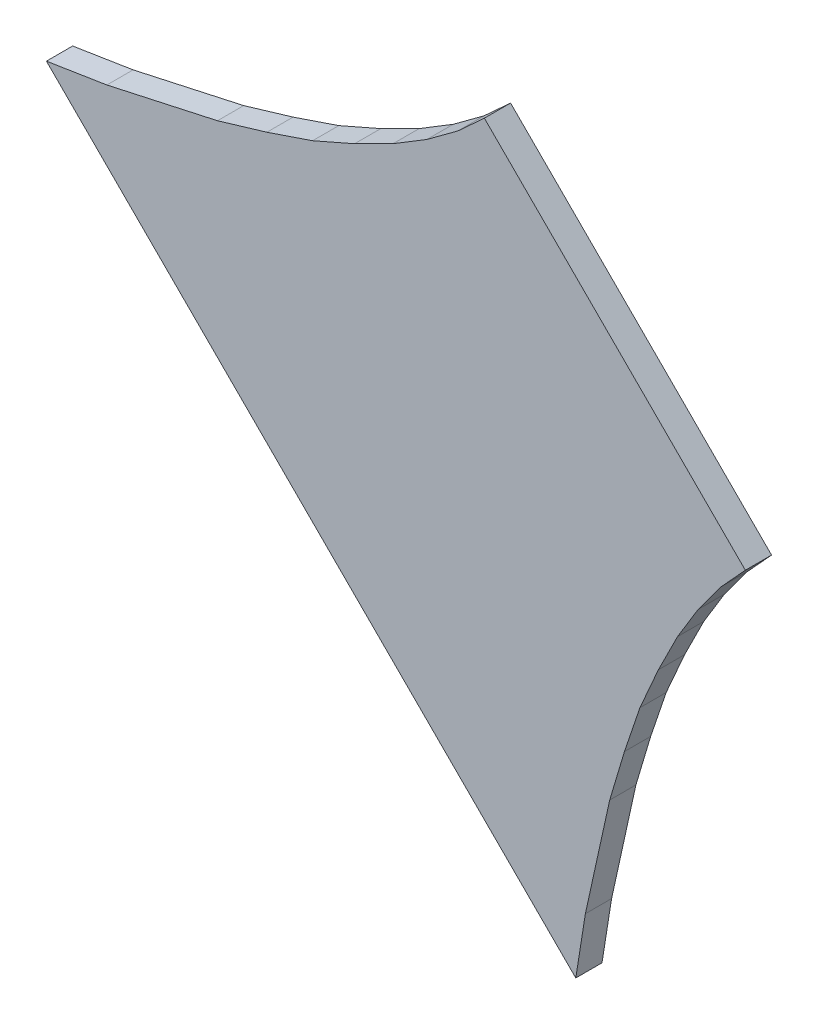
ISO-10303-21;
HEADER;
FILE_DESCRIPTION(('STEP AP214'),'2;1');
FILE_NAME('part.step','',(''),(''),'','','');
FILE_SCHEMA(('AUTOMOTIVE_DESIGN { 1 0 10303 214 1 1 1 1 }'));
ENDSEC;
DATA;
#1=APPLICATION_CONTEXT('core data for automotive mechanical design processes');
#2=APPLICATION_PROTOCOL_DEFINITION('international standard','automotive_design',2000,#1);
#3=PRODUCT_CONTEXT('',#1,'mechanical');
#4=PRODUCT('Part','Part','',(#3));
#5=PRODUCT_RELATED_PRODUCT_CATEGORY('part','',(#4));
#6=PRODUCT_DEFINITION_FORMATION('','',#4);
#7=PRODUCT_DEFINITION_CONTEXT('part definition',#1,'design');
#8=PRODUCT_DEFINITION('design','',#6,#7);
#9=PRODUCT_DEFINITION_SHAPE('','',#8);
#10=(LENGTH_UNIT() NAMED_UNIT(*) SI_UNIT(.MILLI.,.METRE.));
#11=(NAMED_UNIT(*) PLANE_ANGLE_UNIT() SI_UNIT($,.RADIAN.));
#12=(NAMED_UNIT(*) SI_UNIT($,.STERADIAN.) SOLID_ANGLE_UNIT());
#13=UNCERTAINTY_MEASURE_WITH_UNIT(LENGTH_MEASURE(1.E-05),#10,'distance_accuracy_value','');
#14=(GEOMETRIC_REPRESENTATION_CONTEXT(3) GLOBAL_UNCERTAINTY_ASSIGNED_CONTEXT((#13)) GLOBAL_UNIT_ASSIGNED_CONTEXT((#10,
#11,#12)) REPRESENTATION_CONTEXT('',''));
#15=CARTESIAN_POINT('',(0.,0.,0.));
#16=DIRECTION('',(0.,0.,1.));
#17=DIRECTION('',(1.,0.,0.));
#18=AXIS2_PLACEMENT_3D('',#15,#16,#17);
#19=CARTESIAN_POINT('',(86.4049987792969,96.359001159668,0.));
#20=DIRECTION('',(0.675823662339763,-0.737063346953075,0.));
#21=DIRECTION('',(-0.737063346953075,-0.675823662339763,0.));
#22=AXIS2_PLACEMENT_3D('',#19,#20,#21);
#23=PLANE('',#22);
#24=DIRECTION('',(-0.737063346953075,-0.675823662339763,0.));
#25=VECTOR('',#24,1.);
#26=CARTESIAN_POINT('',(86.4049987792969,96.359001159668,0.03556));
#27=LINE('',#26,#25);
#28=CARTESIAN_POINT('',(86.4049987792969,96.359001159668,0.03556));
#29=VERTEX_POINT('',#28);
#30=CARTESIAN_POINT('',(86.3690032958984,96.3259963989258,0.03556));
#31=VERTEX_POINT('',#30);
#32=EDGE_CURVE('E11',#29,#31,#27,.T.);
#33=ORIENTED_EDGE('',*,*,#32,.F.);
#34=DIRECTION('',(0.,0.,1.));
#35=VECTOR('',#34,1.);
#36=CARTESIAN_POINT('',(86.4049987792969,96.359001159668,0.));
#37=LINE('',#36,#35);
#38=CARTESIAN_POINT('',(86.4049987792969,96.359001159668,0.));
#39=VERTEX_POINT('',#38);
#40=EDGE_CURVE('E24',#39,#29,#37,.T.);
#41=ORIENTED_EDGE('',*,*,#40,.F.);
#42=DIRECTION('',(-0.737063346953075,-0.675823662339763,0.));
#43=VECTOR('',#42,1.);
#44=CARTESIAN_POINT('',(86.4049987792969,96.359001159668,0.));
#45=LINE('',#44,#43);
#46=CARTESIAN_POINT('',(86.3690032958984,96.3259963989258,0.));
#47=VERTEX_POINT('',#46);
#48=EDGE_CURVE('E172',#39,#47,#45,.T.);
#49=ORIENTED_EDGE('',*,*,#48,.T.);
#50=DIRECTION('',(0.,0.,1.));
#51=VECTOR('',#50,1.);
#52=CARTESIAN_POINT('',(86.3690032958984,96.3259963989258,0.));
#53=LINE('',#52,#51);
#54=EDGE_CURVE('E37',#47,#31,#53,.T.);
#55=ORIENTED_EDGE('',*,*,#54,.T.);
#56=EDGE_LOOP('',(#33,#41,#49,#55));
#57=FACE_BOUND('',#56,.T.);
#58=ADVANCED_FACE('F17',(#57),#23,.F.);
#59=CARTESIAN_POINT('',(86.3690032958984,96.3259963989258,0.));
#60=DIRECTION('',(0.593832022525237,-0.80458904356422,0.));
#61=DIRECTION('',(-0.80458904356422,-0.593832022525237,0.));
#62=AXIS2_PLACEMENT_3D('',#59,#60,#61);
#63=PLANE('',#62);
#64=DIRECTION('',(-0.80458904356422,-0.593832022525237,0.));
#65=VECTOR('',#64,1.);
#66=CARTESIAN_POINT('',(86.3690032958984,96.3259963989258,0.03556));
#67=LINE('',#66,#65);
#68=CARTESIAN_POINT('',(86.3270034790039,96.2949981689453,0.03556));
#69=VERTEX_POINT('',#68);
#70=EDGE_CURVE('E308',#31,#69,#67,.T.);
#71=ORIENTED_EDGE('',*,*,#70,.F.);
#72=ORIENTED_EDGE('',*,*,#54,.F.);
#73=DIRECTION('',(-0.80458904356422,-0.593832022525237,0.));
#74=VECTOR('',#73,1.);
#75=CARTESIAN_POINT('',(86.3690032958984,96.3259963989258,0.));
#76=LINE('',#75,#74);
#77=CARTESIAN_POINT('',(86.3270034790039,96.2949981689453,0.));
#78=VERTEX_POINT('',#77);
#79=EDGE_CURVE('E305',#47,#78,#76,.T.);
#80=ORIENTED_EDGE('',*,*,#79,.T.);
#81=DIRECTION('',(0.,0.,1.));
#82=VECTOR('',#81,1.);
#83=CARTESIAN_POINT('',(86.3270034790039,96.2949981689453,0.));
#84=LINE('',#83,#82);
#85=EDGE_CURVE('E303',#78,#69,#84,.T.);
#86=ORIENTED_EDGE('',*,*,#85,.T.);
#87=EDGE_LOOP('',(#71,#72,#80,#86));
#88=FACE_BOUND('',#87,.T.);
#89=ADVANCED_FACE('F316',(#88),#63,.F.);
#90=CARTESIAN_POINT('',(86.3270034790039,96.2949981689453,0.));
#91=DIRECTION('',(0.51990200491478,-0.854225909982595,0.));
#92=DIRECTION('',(-0.854225909982595,-0.51990200491478,0.));
#93=AXIS2_PLACEMENT_3D('',#90,#91,#92);
#94=PLANE('',#93);
#95=DIRECTION('',(-0.854225909982595,-0.51990200491478,0.));
#96=VECTOR('',#95,1.);
#97=CARTESIAN_POINT('',(86.3270034790039,96.2949981689453,0.03556));
#98=LINE('',#97,#96);
#99=CARTESIAN_POINT('',(86.2809982299805,96.2669982910156,0.03556));
#100=VERTEX_POINT('',#99);
#101=EDGE_CURVE('E300',#69,#100,#98,.T.);
#102=ORIENTED_EDGE('',*,*,#101,.F.);
#103=ORIENTED_EDGE('',*,*,#85,.F.);
#104=DIRECTION('',(-0.854225909982595,-0.51990200491478,0.));
#105=VECTOR('',#104,1.);
#106=CARTESIAN_POINT('',(86.3270034790039,96.2949981689453,0.));
#107=LINE('',#106,#105);
#108=CARTESIAN_POINT('',(86.2809982299805,96.2669982910156,0.));
#109=VERTEX_POINT('',#108);
#110=EDGE_CURVE('E297',#78,#109,#107,.T.);
#111=ORIENTED_EDGE('',*,*,#110,.T.);
#112=DIRECTION('',(0.,0.,1.));
#113=VECTOR('',#112,1.);
#114=CARTESIAN_POINT('',(86.2809982299805,96.2669982910156,0.));
#115=LINE('',#114,#113);
#116=EDGE_CURVE('E295',#109,#100,#115,.T.);
#117=ORIENTED_EDGE('',*,*,#116,.T.);
#118=EDGE_LOOP('',(#102,#103,#111,#117));
#119=FACE_BOUND('',#118,.T.);
#120=ADVANCED_FACE('F322',(#119),#94,.F.);
#121=CARTESIAN_POINT('',(86.2809982299805,96.2669982910156,0.));
#122=DIRECTION('',(0.447213595499958,-0.894427190999916,0.));
#123=DIRECTION('',(-0.894427190999916,-0.447213595499958,0.));
#124=AXIS2_PLACEMENT_3D('',#121,#122,#123);
#125=PLANE('',#124);
#126=DIRECTION('',(-0.894427190999916,-0.447213595499958,0.));
#127=VECTOR('',#126,1.);
#128=CARTESIAN_POINT('',(86.2809982299805,96.2669982910156,0.03556));
#129=LINE('',#128,#127);
#130=CARTESIAN_POINT('',(86.2289962768555,96.2409973144531,0.03556));
#131=VERTEX_POINT('',#130);
#132=EDGE_CURVE('E292',#100,#131,#129,.T.);
#133=ORIENTED_EDGE('',*,*,#132,.F.);
#134=ORIENTED_EDGE('',*,*,#116,.F.);
#135=DIRECTION('',(-0.894427190999916,-0.447213595499958,0.));
#136=VECTOR('',#135,1.);
#137=CARTESIAN_POINT('',(86.2809982299805,96.2669982910156,0.));
#138=LINE('',#137,#136);
#139=CARTESIAN_POINT('',(86.2289962768555,96.2409973144531,0.));
#140=VERTEX_POINT('',#139);
#141=EDGE_CURVE('E289',#109,#140,#138,.T.);
#142=ORIENTED_EDGE('',*,*,#141,.T.);
#143=DIRECTION('',(0.,0.,1.));
#144=VECTOR('',#143,1.);
#145=CARTESIAN_POINT('',(86.2289962768555,96.2409973144531,0.));
#146=LINE('',#145,#144);
#147=EDGE_CURVE('E287',#140,#131,#146,.T.);
#148=ORIENTED_EDGE('',*,*,#147,.T.);
#149=EDGE_LOOP('',(#133,#134,#142,#148));
#150=FACE_BOUND('',#149,.T.);
#151=ADVANCED_FACE('F324',(#150),#125,.F.);
#152=CARTESIAN_POINT('',(86.2289962768555,96.2409973144531,0.));
#153=DIRECTION('',(0.401583937513721,-0.91582222135684,0.));
#154=DIRECTION('',(-0.91582222135684,-0.401583937513721,0.));
#155=AXIS2_PLACEMENT_3D('',#152,#153,#154);
#156=PLANE('',#155);
#157=DIRECTION('',(-0.91582222135684,-0.401583937513721,0.));
#158=VECTOR('',#157,1.);
#159=CARTESIAN_POINT('',(86.2289962768555,96.2409973144531,0.03556));
#160=LINE('',#159,#158);
#161=CARTESIAN_POINT('',(86.1719970703125,96.2160034179688,0.03556));
#162=VERTEX_POINT('',#161);
#163=EDGE_CURVE('E284',#131,#162,#160,.T.);
#164=ORIENTED_EDGE('',*,*,#163,.F.);
#165=ORIENTED_EDGE('',*,*,#147,.F.);
#166=DIRECTION('',(-0.91582222135684,-0.401583937513721,0.));
#167=VECTOR('',#166,1.);
#168=CARTESIAN_POINT('',(86.2289962768555,96.2409973144531,0.));
#169=LINE('',#168,#167);
#170=CARTESIAN_POINT('',(86.1719970703125,96.2160034179688,0.));
#171=VERTEX_POINT('',#170);
#172=EDGE_CURVE('E281',#140,#171,#169,.T.);
#173=ORIENTED_EDGE('',*,*,#172,.T.);
#174=DIRECTION('',(0.,0.,1.));
#175=VECTOR('',#174,1.);
#176=CARTESIAN_POINT('',(86.1719970703125,96.2160034179688,0.));
#177=LINE('',#176,#175);
#178=EDGE_CURVE('E279',#171,#162,#177,.T.);
#179=ORIENTED_EDGE('',*,*,#178,.T.);
#180=EDGE_LOOP('',(#164,#165,#173,#179));
#181=FACE_BOUND('',#180,.T.);
#182=ADVANCED_FACE('F329',(#181),#156,.F.);
#183=CARTESIAN_POINT('',(86.1719970703125,96.2160034179688,0.));
#184=DIRECTION('',(0.320874490303508,-0.94712172473894,0.));
#185=DIRECTION('',(-0.94712172473894,-0.320874490303508,0.));
#186=AXIS2_PLACEMENT_3D('',#183,#184,#185);
#187=PLANE('',#186);
#188=DIRECTION('',(-0.94712172473894,-0.320874490303508,0.));
#189=VECTOR('',#188,1.);
#190=CARTESIAN_POINT('',(86.1719970703125,96.2160034179688,0.03556));
#191=LINE('',#190,#189);
#192=CARTESIAN_POINT('',(86.1100006103516,96.1949996948242,0.03556));
#193=VERTEX_POINT('',#192);
#194=EDGE_CURVE('E276',#162,#193,#191,.T.);
#195=ORIENTED_EDGE('',*,*,#194,.F.);
#196=ORIENTED_EDGE('',*,*,#178,.F.);
#197=DIRECTION('',(-0.94712172473894,-0.320874490303508,0.));
#198=VECTOR('',#197,1.);
#199=CARTESIAN_POINT('',(86.1719970703125,96.2160034179688,0.));
#200=LINE('',#199,#198);
#201=CARTESIAN_POINT('',(86.1100006103516,96.1949996948242,0.));
#202=VERTEX_POINT('',#201);
#203=EDGE_CURVE('E273',#171,#202,#200,.T.);
#204=ORIENTED_EDGE('',*,*,#203,.T.);
#205=DIRECTION('',(0.,0.,1.));
#206=VECTOR('',#205,1.);
#207=CARTESIAN_POINT('',(86.1100006103516,96.1949996948242,0.));
#208=LINE('',#207,#206);
#209=EDGE_CURVE('E271',#202,#193,#208,.T.);
#210=ORIENTED_EDGE('',*,*,#209,.T.);
#211=EDGE_LOOP('',(#195,#196,#204,#210));
#212=FACE_BOUND('',#211,.T.);
#213=ADVANCED_FACE('F332',(#212),#187,.F.);
#214=CARTESIAN_POINT('',(86.1100006103516,96.1949996948242,0.));
#215=DIRECTION('',(0.285986180602538,-0.958233742102819,0.));
#216=DIRECTION('',(-0.958233742102819,-0.285986180602538,0.));
#217=AXIS2_PLACEMENT_3D('',#214,#215,#216);
#218=PLANE('',#217);
#219=DIRECTION('',(-0.958233742102819,-0.285986180602538,0.));
#220=VECTOR('',#219,1.);
#221=CARTESIAN_POINT('',(86.1100006103516,96.1949996948242,0.03556));
#222=LINE('',#221,#220);
#223=CARTESIAN_POINT('',(86.0429992675781,96.1750030517578,0.03556));
#224=VERTEX_POINT('',#223);
#225=EDGE_CURVE('E268',#193,#224,#222,.T.);
#226=ORIENTED_EDGE('',*,*,#225,.F.);
#227=ORIENTED_EDGE('',*,*,#209,.F.);
#228=DIRECTION('',(-0.958233742102819,-0.285986180602538,0.));
#229=VECTOR('',#228,1.);
#230=CARTESIAN_POINT('',(86.1100006103516,96.1949996948242,0.));
#231=LINE('',#230,#229);
#232=CARTESIAN_POINT('',(86.0429992675781,96.1750030517578,0.));
#233=VERTEX_POINT('',#232);
#234=EDGE_CURVE('E265',#202,#233,#231,.T.);
#235=ORIENTED_EDGE('',*,*,#234,.T.);
#236=DIRECTION('',(0.,0.,1.));
#237=VECTOR('',#236,1.);
#238=CARTESIAN_POINT('',(86.0429992675781,96.1750030517578,0.));
#239=LINE('',#238,#237);
#240=EDGE_CURVE('E263',#233,#224,#239,.T.);
#241=ORIENTED_EDGE('',*,*,#240,.T.);
#242=EDGE_LOOP('',(#226,#227,#235,#241));
#243=FACE_BOUND('',#242,.T.);
#244=ADVANCED_FACE('F337',(#243),#218,.F.);
#245=CARTESIAN_POINT('',(86.0429992675781,96.1750030517578,0.));
#246=DIRECTION('',(0.214889263378161,-0.976638420545082,0.));
#247=DIRECTION('',(-0.976638420545082,-0.214889263378161,0.));
#248=AXIS2_PLACEMENT_3D('',#245,#246,#247);
#249=PLANE('',#248);
#250=DIRECTION('',(-0.976638420545081,-0.214889263378161,0.));
#251=VECTOR('',#250,1.);
#252=CARTESIAN_POINT('',(86.0429992675781,96.1750030517578,0.03556));
#253=LINE('',#252,#251);
#254=CARTESIAN_POINT('',(85.8929977416992,96.1419982910156,0.03556));
#255=VERTEX_POINT('',#254);
#256=EDGE_CURVE('E260',#224,#255,#253,.T.);
#257=ORIENTED_EDGE('',*,*,#256,.F.);
#258=ORIENTED_EDGE('',*,*,#240,.F.);
#259=DIRECTION('',(-0.976638420545081,-0.214889263378161,0.));
#260=VECTOR('',#259,1.);
#261=CARTESIAN_POINT('',(86.0429992675781,96.1750030517578,0.));
#262=LINE('',#261,#260);
#263=CARTESIAN_POINT('',(85.8929977416992,96.1419982910156,0.));
#264=VERTEX_POINT('',#263);
#265=EDGE_CURVE('E257',#233,#264,#262,.T.);
#266=ORIENTED_EDGE('',*,*,#265,.T.);
#267=DIRECTION('',(0.,0.,1.));
#268=VECTOR('',#267,1.);
#269=CARTESIAN_POINT('',(85.8929977416992,96.1419982910156,0.));
#270=LINE('',#269,#268);
#271=EDGE_CURVE('E255',#264,#255,#270,.T.);
#272=ORIENTED_EDGE('',*,*,#271,.T.);
#273=EDGE_LOOP('',(#257,#258,#266,#272));
#274=FACE_BOUND('',#273,.T.);
#275=ADVANCED_FACE('F340',(#274),#249,.F.);
#276=CARTESIAN_POINT('',(85.8929977416992,96.1419982910156,0.));
#277=DIRECTION('',(0.156585427012916,-0.987664418741094,0.));
#278=DIRECTION('',(-0.987664418741094,-0.156585427012916,0.));
#279=AXIS2_PLACEMENT_3D('',#276,#277,#278);
#280=PLANE('',#279);
#281=DIRECTION('',(-0.987664418741094,-0.156585427012916,0.));
#282=VECTOR('',#281,1.);
#283=CARTESIAN_POINT('',(85.8929977416992,96.1419982910156,0.03556));
#284=LINE('',#283,#282);
#285=CARTESIAN_POINT('',(85.8109970092773,96.1289978027344,0.03556));
#286=VERTEX_POINT('',#285);
#287=EDGE_CURVE('E252',#255,#286,#284,.T.);
#288=ORIENTED_EDGE('',*,*,#287,.F.);
#289=ORIENTED_EDGE('',*,*,#271,.F.);
#290=DIRECTION('',(-0.987664418741094,-0.156585427012916,0.));
#291=VECTOR('',#290,1.);
#292=CARTESIAN_POINT('',(85.8929977416992,96.1419982910156,0.));
#293=LINE('',#292,#291);
#294=CARTESIAN_POINT('',(85.8109970092773,96.1289978027344,0.));
#295=VERTEX_POINT('',#294);
#296=EDGE_CURVE('E249',#264,#295,#293,.T.);
#297=ORIENTED_EDGE('',*,*,#296,.T.);
#298=DIRECTION('',(0.,0.,1.));
#299=VECTOR('',#298,1.);
#300=CARTESIAN_POINT('',(85.8109970092773,96.1289978027344,0.));
#301=LINE('',#300,#299);
#302=EDGE_CURVE('E247',#295,#286,#301,.T.);
#303=ORIENTED_EDGE('',*,*,#302,.T.);
#304=EDGE_LOOP('',(#288,#289,#297,#303));
#305=FACE_BOUND('',#304,.T.);
#306=ADVANCED_FACE('F345',(#305),#280,.F.);
#307=CARTESIAN_POINT('',(85.8109970092773,96.1289978027344,0.));
#308=DIRECTION('',(0.707103024346592,0.707110538006543,0.));
#309=DIRECTION('',(0.707110538006543,-0.707103024346592,0.));
#310=AXIS2_PLACEMENT_3D('',#307,#308,#309);
#311=PLANE('',#310);
#312=DIRECTION('',(0.707110538006543,-0.707103024346592,0.));
#313=VECTOR('',#312,1.);
#314=CARTESIAN_POINT('',(85.8109970092773,96.1289978027344,0.03556));
#315=LINE('',#314,#313);
#316=CARTESIAN_POINT('',(86.5289993286133,95.411003112793,0.03556));
#317=VERTEX_POINT('',#316);
#318=EDGE_CURVE('E244',#286,#317,#315,.T.);
#319=ORIENTED_EDGE('',*,*,#318,.F.);
#320=ORIENTED_EDGE('',*,*,#302,.F.);
#321=DIRECTION('',(0.707110538006543,-0.707103024346592,0.));
#322=VECTOR('',#321,1.);
#323=CARTESIAN_POINT('',(85.8109970092773,96.1289978027344,0.));
#324=LINE('',#323,#322);
#325=CARTESIAN_POINT('',(86.5289993286133,95.411003112793,0.));
#326=VERTEX_POINT('',#325);
#327=EDGE_CURVE('E241',#295,#326,#324,.T.);
#328=ORIENTED_EDGE('',*,*,#327,.T.);
#329=DIRECTION('',(0.,0.,1.));
#330=VECTOR('',#329,1.);
#331=CARTESIAN_POINT('',(86.5289993286133,95.411003112793,0.));
#332=LINE('',#331,#330);
#333=EDGE_CURVE('E239',#326,#317,#332,.T.);
#334=ORIENTED_EDGE('',*,*,#333,.T.);
#335=EDGE_LOOP('',(#319,#320,#328,#334));
#336=FACE_BOUND('',#335,.T.);
#337=ADVANCED_FACE('F348',(#336),#311,.F.);
#338=CARTESIAN_POINT('',(86.5289993286133,95.411003112793,0.));
#339=DIRECTION('',(-0.98766216531375,0.156599639871092,0.));
#340=DIRECTION('',(0.156599639871092,0.98766216531375,0.));
#341=AXIS2_PLACEMENT_3D('',#338,#339,#340);
#342=PLANE('',#341);
#343=DIRECTION('',(0.156599639871092,0.98766216531375,0.));
#344=VECTOR('',#343,1.);
#345=CARTESIAN_POINT('',(86.5289993286133,95.411003112793,0.03556));
#346=LINE('',#345,#344);
#347=CARTESIAN_POINT('',(86.5419998168945,95.4929962158203,0.03556));
#348=VERTEX_POINT('',#347);
#349=EDGE_CURVE('E236',#317,#348,#346,.T.);
#350=ORIENTED_EDGE('',*,*,#349,.F.);
#351=ORIENTED_EDGE('',*,*,#333,.F.);
#352=DIRECTION('',(0.156599639871092,0.98766216531375,0.));
#353=VECTOR('',#352,1.);
#354=CARTESIAN_POINT('',(86.5289993286133,95.411003112793,0.));
#355=LINE('',#354,#353);
#356=CARTESIAN_POINT('',(86.5419998168945,95.4929962158203,0.));
#357=VERTEX_POINT('',#356);
#358=EDGE_CURVE('E233',#326,#357,#355,.T.);
#359=ORIENTED_EDGE('',*,*,#358,.T.);
#360=DIRECTION('',(0.,0.,1.));
#361=VECTOR('',#360,1.);
#362=CARTESIAN_POINT('',(86.5419998168945,95.4929962158203,0.));
#363=LINE('',#362,#361);
#364=EDGE_CURVE('E231',#357,#348,#363,.T.);
#365=ORIENTED_EDGE('',*,*,#364,.T.);
#366=EDGE_LOOP('',(#350,#351,#359,#365));
#367=FACE_BOUND('',#366,.T.);
#368=ADVANCED_FACE('F353',(#367),#342,.F.);
#369=CARTESIAN_POINT('',(86.5419998168945,95.4929962158203,0.));
#370=DIRECTION('',(-0.976648844522904,0.214841882537082,0.));
#371=DIRECTION('',(0.214841882537082,0.976648844522904,0.));
#372=AXIS2_PLACEMENT_3D('',#369,#370,#371);
#373=PLANE('',#372);
#374=DIRECTION('',(0.214841882537082,0.976648844522904,0.));
#375=VECTOR('',#374,1.);
#376=CARTESIAN_POINT('',(86.5419998168945,95.4929962158203,0.03556));
#377=LINE('',#376,#375);
#378=CARTESIAN_POINT('',(86.5749969482422,95.6429977416992,0.03556));
#379=VERTEX_POINT('',#378);
#380=EDGE_CURVE('E228',#348,#379,#377,.T.);
#381=ORIENTED_EDGE('',*,*,#380,.F.);
#382=ORIENTED_EDGE('',*,*,#364,.F.);
#383=DIRECTION('',(0.214841882537082,0.976648844522904,0.));
#384=VECTOR('',#383,1.);
#385=CARTESIAN_POINT('',(86.5419998168945,95.4929962158203,0.));
#386=LINE('',#385,#384);
#387=CARTESIAN_POINT('',(86.5749969482422,95.6429977416992,0.));
#388=VERTEX_POINT('',#387);
#389=EDGE_CURVE('E225',#357,#388,#386,.T.);
#390=ORIENTED_EDGE('',*,*,#389,.T.);
#391=DIRECTION('',(0.,0.,1.));
#392=VECTOR('',#391,1.);
#393=CARTESIAN_POINT('',(86.5749969482422,95.6429977416992,0.));
#394=LINE('',#393,#392);
#395=EDGE_CURVE('E223',#388,#379,#394,.T.);
#396=ORIENTED_EDGE('',*,*,#395,.T.);
#397=EDGE_LOOP('',(#381,#382,#390,#396));
#398=FACE_BOUND('',#397,.T.);
#399=ADVANCED_FACE('F356',(#398),#373,.F.);
#400=CARTESIAN_POINT('',(86.5749969482422,95.6429977416992,0.));
#401=DIRECTION('',(-0.958203836191332,0.28608636512112,0.));
#402=DIRECTION('',(0.28608636512112,0.958203836191332,0.));
#403=AXIS2_PLACEMENT_3D('',#400,#401,#402);
#404=PLANE('',#403);
#405=DIRECTION('',(0.28608636512112,0.958203836191332,0.));
#406=VECTOR('',#405,1.);
#407=CARTESIAN_POINT('',(86.5749969482422,95.6429977416992,0.03556));
#408=LINE('',#407,#406);
#409=CARTESIAN_POINT('',(86.5950012207031,95.7099990844727,0.03556));
#410=VERTEX_POINT('',#409);
#411=EDGE_CURVE('E220',#379,#410,#408,.T.);
#412=ORIENTED_EDGE('',*,*,#411,.F.);
#413=ORIENTED_EDGE('',*,*,#395,.F.);
#414=DIRECTION('',(0.28608636512112,0.958203836191332,0.));
#415=VECTOR('',#414,1.);
#416=CARTESIAN_POINT('',(86.5749969482422,95.6429977416992,0.));
#417=LINE('',#416,#415);
#418=CARTESIAN_POINT('',(86.5950012207031,95.7099990844727,0.));
#419=VERTEX_POINT('',#418);
#420=EDGE_CURVE('E217',#388,#419,#417,.T.);
#421=ORIENTED_EDGE('',*,*,#420,.T.);
#422=DIRECTION('',(0.,0.,1.));
#423=VECTOR('',#422,1.);
#424=CARTESIAN_POINT('',(86.5950012207031,95.7099990844727,0.));
#425=LINE('',#424,#423);
#426=EDGE_CURVE('E215',#419,#410,#425,.T.);
#427=ORIENTED_EDGE('',*,*,#426,.T.);
#428=EDGE_LOOP('',(#412,#413,#421,#427));
#429=FACE_BOUND('',#428,.T.);
#430=ADVANCED_FACE('F361',(#429),#404,.F.);
#431=CARTESIAN_POINT('',(86.5950012207031,95.7099990844727,0.));
#432=DIRECTION('',(-0.947169133182324,0.320734521289253,0.));
#433=DIRECTION('',(0.320734521289253,0.947169133182324,0.));
#434=AXIS2_PLACEMENT_3D('',#431,#432,#433);
#435=PLANE('',#434);
#436=DIRECTION('',(0.320734521289253,0.947169133182324,0.));
#437=VECTOR('',#436,1.);
#438=CARTESIAN_POINT('',(86.5950012207031,95.7099990844727,0.03556));
#439=LINE('',#438,#437);
#440=CARTESIAN_POINT('',(86.6159973144531,95.7720031738281,0.03556));
#441=VERTEX_POINT('',#440);
#442=EDGE_CURVE('E212',#410,#441,#439,.T.);
#443=ORIENTED_EDGE('',*,*,#442,.F.);
#444=ORIENTED_EDGE('',*,*,#426,.F.);
#445=DIRECTION('',(0.320734521289253,0.947169133182324,0.));
#446=VECTOR('',#445,1.);
#447=CARTESIAN_POINT('',(86.5950012207031,95.7099990844727,0.));
#448=LINE('',#447,#446);
#449=CARTESIAN_POINT('',(86.6159973144531,95.7720031738281,0.));
#450=VERTEX_POINT('',#449);
#451=EDGE_CURVE('E209',#419,#450,#448,.T.);
#452=ORIENTED_EDGE('',*,*,#451,.T.);
#453=DIRECTION('',(0.,0.,1.));
#454=VECTOR('',#453,1.);
#455=CARTESIAN_POINT('',(86.6159973144531,95.7720031738281,0.));
#456=LINE('',#455,#454);
#457=EDGE_CURVE('E207',#450,#441,#456,.T.);
#458=ORIENTED_EDGE('',*,*,#457,.T.);
#459=EDGE_LOOP('',(#443,#444,#452,#458));
#460=FACE_BOUND('',#459,.T.);
#461=ADVANCED_FACE('F364',(#460),#435,.F.);
#462=CARTESIAN_POINT('',(86.6159973144531,95.7720031738281,0.));
#463=DIRECTION('',(-0.915777134064196,0.401686744522604,0.));
#464=DIRECTION('',(0.401686744522604,0.915777134064196,0.));
#465=AXIS2_PLACEMENT_3D('',#462,#463,#464);
#466=PLANE('',#465);
#467=DIRECTION('',(0.401686744522604,0.915777134064196,0.));
#468=VECTOR('',#467,1.);
#469=CARTESIAN_POINT('',(86.6159973144531,95.7720031738281,0.03556));
#470=LINE('',#469,#468);
#471=CARTESIAN_POINT('',(86.640998840332,95.8290023803711,0.03556));
#472=VERTEX_POINT('',#471);
#473=EDGE_CURVE('E204',#441,#472,#470,.T.);
#474=ORIENTED_EDGE('',*,*,#473,.F.);
#475=ORIENTED_EDGE('',*,*,#457,.F.);
#476=DIRECTION('',(0.401686744522604,0.915777134064196,0.));
#477=VECTOR('',#476,1.);
#478=CARTESIAN_POINT('',(86.6159973144531,95.7720031738281,0.));
#479=LINE('',#478,#477);
#480=CARTESIAN_POINT('',(86.640998840332,95.8290023803711,0.));
#481=VERTEX_POINT('',#480);
#482=EDGE_CURVE('E201',#450,#481,#479,.T.);
#483=ORIENTED_EDGE('',*,*,#482,.T.);
#484=DIRECTION('',(0.,0.,1.));
#485=VECTOR('',#484,1.);
#486=CARTESIAN_POINT('',(86.640998840332,95.8290023803711,0.));
#487=LINE('',#486,#485);
#488=EDGE_CURVE('E199',#481,#472,#487,.T.);
#489=ORIENTED_EDGE('',*,*,#488,.T.);
#490=EDGE_LOOP('',(#474,#475,#483,#489));
#491=FACE_BOUND('',#490,.T.);
#492=ADVANCED_FACE('F369',(#491),#466,.F.);
#493=CARTESIAN_POINT('',(86.640998840332,95.8290023803711,0.));
#494=DIRECTION('',(-0.894400941449338,0.447266090749721,0.));
#495=DIRECTION('',(0.447266090749721,0.894400941449338,0.));
#496=AXIS2_PLACEMENT_3D('',#493,#494,#495);
#497=PLANE('',#496);
#498=DIRECTION('',(0.447266090749721,0.894400941449338,0.));
#499=VECTOR('',#498,1.);
#500=CARTESIAN_POINT('',(86.640998840332,95.8290023803711,0.03556));
#501=LINE('',#500,#499);
#502=CARTESIAN_POINT('',(86.6669998168945,95.8809967041016,0.03556));
#503=VERTEX_POINT('',#502);
#504=EDGE_CURVE('E196',#472,#503,#501,.T.);
#505=ORIENTED_EDGE('',*,*,#504,.F.);
#506=ORIENTED_EDGE('',*,*,#488,.F.);
#507=DIRECTION('',(0.447266090749721,0.894400941449338,0.));
#508=VECTOR('',#507,1.);
#509=CARTESIAN_POINT('',(86.640998840332,95.8290023803711,0.));
#510=LINE('',#509,#508);
#511=CARTESIAN_POINT('',(86.6669998168945,95.8809967041016,0.));
#512=VERTEX_POINT('',#511);
#513=EDGE_CURVE('E193',#481,#512,#510,.T.);
#514=ORIENTED_EDGE('',*,*,#513,.T.);
#515=DIRECTION('',(0.,0.,1.));
#516=VECTOR('',#515,1.);
#517=CARTESIAN_POINT('',(86.6669998168945,95.8809967041016,0.));
#518=LINE('',#517,#516);
#519=EDGE_CURVE('E191',#512,#503,#518,.T.);
#520=ORIENTED_EDGE('',*,*,#519,.T.);
#521=EDGE_LOOP('',(#505,#506,#514,#520));
#522=FACE_BOUND('',#521,.T.);
#523=ADVANCED_FACE('F372',(#522),#497,.F.);
#524=CARTESIAN_POINT('',(86.6669998168945,95.8809967041016,0.));
#525=DIRECTION('',(-0.854225909982595,0.51990200491478,0.));
#526=DIRECTION('',(0.51990200491478,0.854225909982595,0.));
#527=AXIS2_PLACEMENT_3D('',#524,#525,#526);
#528=PLANE('',#527);
#529=DIRECTION('',(0.51990200491478,0.854225909982595,0.));
#530=VECTOR('',#529,1.);
#531=CARTESIAN_POINT('',(86.6669998168945,95.8809967041016,0.03556));
#532=LINE('',#531,#530);
#533=CARTESIAN_POINT('',(86.6949996948242,95.927001953125,0.03556));
#534=VERTEX_POINT('',#533);
#535=EDGE_CURVE('E188',#503,#534,#532,.T.);
#536=ORIENTED_EDGE('',*,*,#535,.F.);
#537=ORIENTED_EDGE('',*,*,#519,.F.);
#538=DIRECTION('',(0.51990200491478,0.854225909982595,0.));
#539=VECTOR('',#538,1.);
#540=CARTESIAN_POINT('',(86.6669998168945,95.8809967041016,0.));
#541=LINE('',#540,#539);
#542=CARTESIAN_POINT('',(86.6949996948242,95.927001953125,0.));
#543=VERTEX_POINT('',#542);
#544=EDGE_CURVE('E185',#512,#543,#541,.T.);
#545=ORIENTED_EDGE('',*,*,#544,.T.);
#546=DIRECTION('',(0.,0.,1.));
#547=VECTOR('',#546,1.);
#548=CARTESIAN_POINT('',(86.6949996948242,95.927001953125,0.));
#549=LINE('',#548,#547);
#550=EDGE_CURVE('E183',#543,#534,#549,.T.);
#551=ORIENTED_EDGE('',*,*,#550,.T.);
#552=EDGE_LOOP('',(#536,#537,#545,#551));
#553=FACE_BOUND('',#552,.T.);
#554=ADVANCED_FACE('F377',(#553),#528,.F.);
#555=CARTESIAN_POINT('',(86.6949996948242,95.927001953125,0.));
#556=DIRECTION('',(-0.80458904356422,0.593832022525237,0.));
#557=DIRECTION('',(0.593832022525237,0.80458904356422,0.));
#558=AXIS2_PLACEMENT_3D('',#555,#556,#557);
#559=PLANE('',#558);
#560=DIRECTION('',(0.593832022525237,0.80458904356422,0.));
#561=VECTOR('',#560,1.);
#562=CARTESIAN_POINT('',(86.6949996948242,95.927001953125,0.03556));
#563=LINE('',#562,#561);
#564=CARTESIAN_POINT('',(86.7259979248047,95.9690017700195,0.03556));
#565=VERTEX_POINT('',#564);
#566=EDGE_CURVE('E180',#534,#565,#563,.T.);
#567=ORIENTED_EDGE('',*,*,#566,.F.);
#568=ORIENTED_EDGE('',*,*,#550,.F.);
#569=DIRECTION('',(0.593832022525237,0.80458904356422,0.));
#570=VECTOR('',#569,1.);
#571=CARTESIAN_POINT('',(86.6949996948242,95.927001953125,0.));
#572=LINE('',#571,#570);
#573=CARTESIAN_POINT('',(86.7259979248047,95.9690017700195,0.));
#574=VERTEX_POINT('',#573);
#575=EDGE_CURVE('E178',#543,#574,#572,.T.);
#576=ORIENTED_EDGE('',*,*,#575,.T.);
#577=DIRECTION('',(0.,0.,1.));
#578=VECTOR('',#577,1.);
#579=CARTESIAN_POINT('',(86.7259979248047,95.9690017700195,0.));
#580=LINE('',#579,#578);
#581=EDGE_CURVE('E163',#574,#565,#580,.T.);
#582=ORIENTED_EDGE('',*,*,#581,.T.);
#583=EDGE_LOOP('',(#567,#568,#576,#582));
#584=FACE_BOUND('',#583,.T.);
#585=ADVANCED_FACE('F379',(#584),#559,.F.);
#586=CARTESIAN_POINT('',(86.7259979248047,95.9690017700195,0.));
#587=DIRECTION('',(-0.737063346953075,0.675823662339763,0.));
#588=DIRECTION('',(0.675823662339763,0.737063346953075,0.));
#589=AXIS2_PLACEMENT_3D('',#586,#587,#588);
#590=PLANE('',#589);
#591=DIRECTION('',(0.675823662339763,0.737063346953075,0.));
#592=VECTOR('',#591,1.);
#593=CARTESIAN_POINT('',(86.7259979248047,95.9690017700195,0.03556));
#594=LINE('',#593,#592);
#595=CARTESIAN_POINT('',(86.7590026855469,96.004997253418,0.03556));
#596=VERTEX_POINT('',#595);
#597=EDGE_CURVE('E167',#565,#596,#594,.T.);
#598=ORIENTED_EDGE('',*,*,#597,.F.);
#599=ORIENTED_EDGE('',*,*,#581,.F.);
#600=DIRECTION('',(0.675823662339763,0.737063346953075,0.));
#601=VECTOR('',#600,1.);
#602=CARTESIAN_POINT('',(86.7259979248047,95.9690017700195,0.));
#603=LINE('',#602,#601);
#604=CARTESIAN_POINT('',(86.7590026855469,96.004997253418,0.));
#605=VERTEX_POINT('',#604);
#606=EDGE_CURVE('E159',#574,#605,#603,.T.);
#607=ORIENTED_EDGE('',*,*,#606,.T.);
#608=DIRECTION('',(0.,0.,1.));
#609=VECTOR('',#608,1.);
#610=CARTESIAN_POINT('',(86.7590026855469,96.004997253418,0.));
#611=LINE('',#610,#609);
#612=EDGE_CURVE('E149',#605,#596,#611,.T.);
#613=ORIENTED_EDGE('',*,*,#612,.T.);
#614=EDGE_LOOP('',(#598,#599,#607,#613));
#615=FACE_BOUND('',#614,.T.);
#616=ADVANCED_FACE('F162',(#615),#590,.F.);
#617=CARTESIAN_POINT('',(86.7590026855469,96.004997253418,0.));
#618=DIRECTION('',(-0.707106781186548,-0.707106781186548,0.));
#619=DIRECTION('',(-0.707106781186548,0.707106781186548,0.));
#620=AXIS2_PLACEMENT_3D('',#617,#618,#619);
#621=PLANE('',#620);
#622=DIRECTION('',(-0.707106781186548,0.707106781186548,0.));
#623=VECTOR('',#622,1.);
#624=CARTESIAN_POINT('',(86.7590026855469,96.004997253418,0.03556));
#625=LINE('',#624,#623);
#626=EDGE_CURVE('E155',#596,#29,#625,.T.);
#627=ORIENTED_EDGE('',*,*,#626,.F.);
#628=ORIENTED_EDGE('',*,*,#612,.F.);
#629=DIRECTION('',(-0.707106781186548,0.707106781186548,0.));
#630=VECTOR('',#629,1.);
#631=CARTESIAN_POINT('',(86.7590026855469,96.004997253418,0.));
#632=LINE('',#631,#630);
#633=EDGE_CURVE('E153',#605,#39,#632,.T.);
#634=ORIENTED_EDGE('',*,*,#633,.T.);
#635=ORIENTED_EDGE('',*,*,#40,.T.);
#636=EDGE_LOOP('',(#627,#628,#634,#635));
#637=FACE_BOUND('',#636,.T.);
#638=ADVANCED_FACE('F151',(#637),#621,.F.);
#639=CARTESIAN_POINT('',(86.4049987792969,96.359001159668,0.));
#640=DIRECTION('',(0.,0.,1.));
#641=DIRECTION('',(1.,0.,0.));
#642=AXIS2_PLACEMENT_3D('',#639,#640,#641);
#643=PLANE('',#642);
#644=ORIENTED_EDGE('',*,*,#633,.F.);
#645=ORIENTED_EDGE('',*,*,#606,.F.);
#646=ORIENTED_EDGE('',*,*,#575,.F.);
#647=ORIENTED_EDGE('',*,*,#544,.F.);
#648=ORIENTED_EDGE('',*,*,#513,.F.);
#649=ORIENTED_EDGE('',*,*,#482,.F.);
#650=ORIENTED_EDGE('',*,*,#451,.F.);
#651=ORIENTED_EDGE('',*,*,#420,.F.);
#652=ORIENTED_EDGE('',*,*,#389,.F.);
#653=ORIENTED_EDGE('',*,*,#358,.F.);
#654=ORIENTED_EDGE('',*,*,#327,.F.);
#655=ORIENTED_EDGE('',*,*,#296,.F.);
#656=ORIENTED_EDGE('',*,*,#265,.F.);
#657=ORIENTED_EDGE('',*,*,#234,.F.);
#658=ORIENTED_EDGE('',*,*,#203,.F.);
#659=ORIENTED_EDGE('',*,*,#172,.F.);
#660=ORIENTED_EDGE('',*,*,#141,.F.);
#661=ORIENTED_EDGE('',*,*,#110,.F.);
#662=ORIENTED_EDGE('',*,*,#79,.F.);
#663=ORIENTED_EDGE('',*,*,#48,.F.);
#664=EDGE_LOOP('',(#644,#645,#646,#647,#648,#649,#650,#651,#652,#653,#654,#655,#656,#657,#658,
#659,#660,#661,#662,#663));
#665=FACE_BOUND('',#664,.T.);
#666=ADVANCED_FACE('F170',(#665),#643,.F.);
#667=CARTESIAN_POINT('',(86.4049987792969,96.359001159668,0.03556));
#668=DIRECTION('',(0.,0.,1.));
#669=DIRECTION('',(1.,0.,0.));
#670=AXIS2_PLACEMENT_3D('',#667,#668,#669);
#671=PLANE('',#670);
#672=ORIENTED_EDGE('',*,*,#32,.T.);
#673=ORIENTED_EDGE('',*,*,#70,.T.);
#674=ORIENTED_EDGE('',*,*,#101,.T.);
#675=ORIENTED_EDGE('',*,*,#132,.T.);
#676=ORIENTED_EDGE('',*,*,#163,.T.);
#677=ORIENTED_EDGE('',*,*,#194,.T.);
#678=ORIENTED_EDGE('',*,*,#225,.T.);
#679=ORIENTED_EDGE('',*,*,#256,.T.);
#680=ORIENTED_EDGE('',*,*,#287,.T.);
#681=ORIENTED_EDGE('',*,*,#318,.T.);
#682=ORIENTED_EDGE('',*,*,#349,.T.);
#683=ORIENTED_EDGE('',*,*,#380,.T.);
#684=ORIENTED_EDGE('',*,*,#411,.T.);
#685=ORIENTED_EDGE('',*,*,#442,.T.);
#686=ORIENTED_EDGE('',*,*,#473,.T.);
#687=ORIENTED_EDGE('',*,*,#504,.T.);
#688=ORIENTED_EDGE('',*,*,#535,.T.);
#689=ORIENTED_EDGE('',*,*,#566,.T.);
#690=ORIENTED_EDGE('',*,*,#597,.T.);
#691=ORIENTED_EDGE('',*,*,#626,.T.);
#692=EDGE_LOOP('',(#672,#673,#674,#675,#676,#677,#678,#679,#680,#681,#682,#683,#684,#685,#686,
#687,#688,#689,#690,#691));
#693=FACE_BOUND('',#692,.T.);
#694=ADVANCED_FACE('F319',(#693),#671,.T.);
#695=CLOSED_SHELL('',(#58,#89,#120,#151,#182,#213,#244,#275,#306,#337,#368,#399,#430,#461,#492,
#523,#554,#585,#616,#638,#666,#694));
#696=MANIFOLD_SOLID_BREP('B1',#695);
#697=ADVANCED_BREP_SHAPE_REPRESENTATION('',(#18,#696),#14);
#698=SHAPE_DEFINITION_REPRESENTATION(#9,#697);
ENDSEC;
END-ISO-10303-21;
